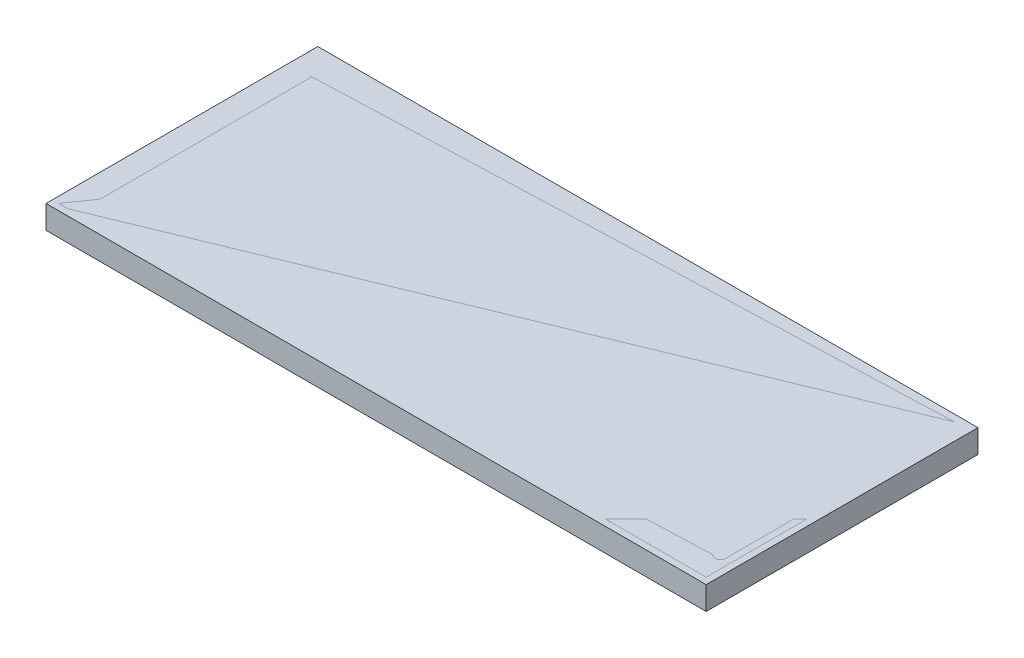
ISO-10303-21;
HEADER;
FILE_DESCRIPTION(('STEP AP214'),'2;1');
FILE_NAME('part.step','',(''),(''),'','','');
FILE_SCHEMA(('AUTOMOTIVE_DESIGN { 1 0 10303 214 1 1 1 1 }'));
ENDSEC;
DATA;
#1=APPLICATION_CONTEXT('core data for automotive mechanical design processes');
#2=APPLICATION_PROTOCOL_DEFINITION('international standard','automotive_design',2000,#1);
#3=PRODUCT_CONTEXT('',#1,'mechanical');
#4=PRODUCT('Part','Part','',(#3));
#5=PRODUCT_RELATED_PRODUCT_CATEGORY('part','',(#4));
#6=PRODUCT_DEFINITION_FORMATION('','',#4);
#7=PRODUCT_DEFINITION_CONTEXT('part definition',#1,'design');
#8=PRODUCT_DEFINITION('design','',#6,#7);
#9=PRODUCT_DEFINITION_SHAPE('','',#8);
#10=(LENGTH_UNIT() NAMED_UNIT(*) SI_UNIT(.MILLI.,.METRE.));
#11=(NAMED_UNIT(*) PLANE_ANGLE_UNIT() SI_UNIT($,.RADIAN.));
#12=(NAMED_UNIT(*) SI_UNIT($,.STERADIAN.) SOLID_ANGLE_UNIT());
#13=UNCERTAINTY_MEASURE_WITH_UNIT(LENGTH_MEASURE(1.E-05),#10,'distance_accuracy_value','');
#14=(GEOMETRIC_REPRESENTATION_CONTEXT(3) GLOBAL_UNCERTAINTY_ASSIGNED_CONTEXT((#13)) GLOBAL_UNIT_ASSIGNED_CONTEXT((#10,
#11,#12)) REPRESENTATION_CONTEXT('',''));
#15=CARTESIAN_POINT('',(0.,0.,0.));
#16=DIRECTION('',(0.,0.,1.));
#17=DIRECTION('',(1.,0.,0.));
#18=AXIS2_PLACEMENT_3D('',#15,#16,#17);
#19=CARTESIAN_POINT('',(-102.156267045852,299.622640817532,522.124764040882));
#20=DIRECTION('',(1.,0.,0.));
#21=DIRECTION('',(0.,0.,-1.));
#22=AXIS2_PLACEMENT_3D('',#19,#20,#21);
#23=PLANE('',#22);
#24=DIRECTION('',(0.,0.,1.));
#25=VECTOR('',#24,1.);
#26=CARTESIAN_POINT('',(-102.156267045852,281.622640817532,522.124764040882));
#27=LINE('',#26,#25);
#28=CARTESIAN_POINT('',(-102.156267045852,281.622640817532,322.124764040882));
#29=VERTEX_POINT('',#28);
#30=CARTESIAN_POINT('',(-102.156267045852,281.622640817532,522.124764040882));
#31=VERTEX_POINT('',#30);
#32=EDGE_CURVE('P0_E80',#29,#31,#27,.T.);
#33=ORIENTED_EDGE('',*,*,#32,.T.);
#34=DIRECTION('',(0.,-1.,0.));
#35=VECTOR('',#34,1.);
#36=CARTESIAN_POINT('',(-102.156267045852,299.622640817532,522.124764040882));
#37=LINE('',#36,#35);
#38=CARTESIAN_POINT('',(-102.156267045852,299.622640817532,522.124764040882));
#39=VERTEX_POINT('',#38);
#40=EDGE_CURVE('P0_E11',#39,#31,#37,.T.);
#41=ORIENTED_EDGE('',*,*,#40,.F.);
#42=DIRECTION('',(0.,0.,1.));
#43=VECTOR('',#42,1.);
#44=CARTESIAN_POINT('',(-102.156267045852,299.622640817532,522.124764040882));
#45=LINE('',#44,#43);
#46=CARTESIAN_POINT('',(-102.156267045852,299.622640817532,322.124764040882));
#47=VERTEX_POINT('',#46);
#48=EDGE_CURVE('P0_E68',#47,#39,#45,.T.);
#49=ORIENTED_EDGE('',*,*,#48,.F.);
#50=DIRECTION('',(0.,-1.,0.));
#51=VECTOR('',#50,1.);
#52=CARTESIAN_POINT('',(-102.156267045852,299.622640817532,322.124764040882));
#53=LINE('',#52,#51);
#54=EDGE_CURVE('P0_E76',#47,#29,#53,.T.);
#55=ORIENTED_EDGE('',*,*,#54,.T.);
#56=EDGE_LOOP('',(#33,#41,#49,#55));
#57=FACE_BOUND('',#56,.T.);
#58=ADVANCED_FACE('P0_F17',(#57),#23,.F.);
#59=CARTESIAN_POINT('',(-102.156267045852,299.622640817532,522.124764040882));
#60=DIRECTION('',(0.,0.,-1.));
#61=DIRECTION('',(-1.,0.,0.));
#62=AXIS2_PLACEMENT_3D('',#59,#60,#61);
#63=PLANE('',#62);
#64=DIRECTION('',(1.,0.,0.));
#65=VECTOR('',#64,1.);
#66=CARTESIAN_POINT('',(-102.156267045852,281.622640817532,522.124764040882));
#67=LINE('',#66,#65);
#68=CARTESIAN_POINT('',(397.843732954148,281.622640817532,522.124764040882));
#69=VERTEX_POINT('',#68);
#70=EDGE_CURVE('P0_E72',#31,#69,#67,.T.);
#71=ORIENTED_EDGE('',*,*,#70,.T.);
#72=DIRECTION('',(0.,-1.,0.));
#73=VECTOR('',#72,1.);
#74=CARTESIAN_POINT('',(397.843732954148,299.622640817532,522.124764040882));
#75=LINE('',#74,#73);
#76=CARTESIAN_POINT('',(397.843732954148,299.622640817532,522.124764040882));
#77=VERTEX_POINT('',#76);
#78=EDGE_CURVE('P0_E25',#77,#69,#75,.T.);
#79=ORIENTED_EDGE('',*,*,#78,.F.);
#80=DIRECTION('',(1.,0.,0.));
#81=VECTOR('',#80,1.);
#82=CARTESIAN_POINT('',(-102.156267045852,299.622640817532,522.124764040882));
#83=LINE('',#82,#81);
#84=EDGE_CURVE('P0_E63',#39,#77,#83,.T.);
#85=ORIENTED_EDGE('',*,*,#84,.F.);
#86=ORIENTED_EDGE('',*,*,#40,.T.);
#87=EDGE_LOOP('',(#71,#79,#85,#86));
#88=FACE_BOUND('',#87,.T.);
#89=ADVANCED_FACE('P0_F71',(#88),#63,.F.);
#90=CARTESIAN_POINT('',(397.843732954148,299.622640817532,522.124764040882));
#91=DIRECTION('',(-1.,0.,0.));
#92=DIRECTION('',(0.,0.,1.));
#93=AXIS2_PLACEMENT_3D('',#90,#91,#92);
#94=PLANE('',#93);
#95=DIRECTION('',(0.,0.,-1.));
#96=VECTOR('',#95,1.);
#97=CARTESIAN_POINT('',(397.843732954148,281.622640817532,522.124764040882));
#98=LINE('',#97,#96);
#99=CARTESIAN_POINT('',(397.843732954148,281.622640817532,322.124764040882));
#100=VERTEX_POINT('',#99);
#101=EDGE_CURVE('P0_E50',#69,#100,#98,.T.);
#102=ORIENTED_EDGE('',*,*,#101,.T.);
#103=DIRECTION('',(0.,-1.,0.));
#104=VECTOR('',#103,1.);
#105=CARTESIAN_POINT('',(397.843732954148,299.622640817532,322.124764040882));
#106=LINE('',#105,#104);
#107=CARTESIAN_POINT('',(397.843732954148,299.622640817532,322.124764040882));
#108=VERTEX_POINT('',#107);
#109=EDGE_CURVE('P0_E73',#108,#100,#106,.T.);
#110=ORIENTED_EDGE('',*,*,#109,.F.);
#111=DIRECTION('',(0.,0.,-1.));
#112=VECTOR('',#111,1.);
#113=CARTESIAN_POINT('',(397.843732954148,299.622640817532,522.124764040882));
#114=LINE('',#113,#112);
#115=EDGE_CURVE('P0_E66',#77,#108,#114,.T.);
#116=ORIENTED_EDGE('',*,*,#115,.F.);
#117=ORIENTED_EDGE('',*,*,#78,.T.);
#118=EDGE_LOOP('',(#102,#110,#116,#117));
#119=FACE_BOUND('',#118,.T.);
#120=ADVANCED_FACE('P0_F74',(#119),#94,.F.);
#121=CARTESIAN_POINT('',(-102.156267045852,299.622640817532,322.124764040882));
#122=DIRECTION('',(0.,0.,1.));
#123=DIRECTION('',(1.,0.,0.));
#124=AXIS2_PLACEMENT_3D('',#121,#122,#123);
#125=PLANE('',#124);
#126=DIRECTION('',(-1.,0.,0.));
#127=VECTOR('',#126,1.);
#128=CARTESIAN_POINT('',(-102.156267045852,281.622640817532,322.124764040882));
#129=LINE('',#128,#127);
#130=EDGE_CURVE('P0_E56',#100,#29,#129,.T.);
#131=ORIENTED_EDGE('',*,*,#130,.T.);
#132=ORIENTED_EDGE('',*,*,#54,.F.);
#133=DIRECTION('',(-1.,0.,0.));
#134=VECTOR('',#133,1.);
#135=CARTESIAN_POINT('',(-102.156267045852,299.622640817532,322.124764040882));
#136=LINE('',#135,#134);
#137=EDGE_CURVE('P0_E33',#108,#47,#136,.T.);
#138=ORIENTED_EDGE('',*,*,#137,.F.);
#139=ORIENTED_EDGE('',*,*,#109,.T.);
#140=EDGE_LOOP('',(#131,#132,#138,#139));
#141=FACE_BOUND('',#140,.T.);
#142=ADVANCED_FACE('P0_F88',(#141),#125,.F.);
#143=CARTESIAN_POINT('',(-102.156267045852,299.622640817532,522.124764040882));
#144=DIRECTION('',(0.,-1.,0.));
#145=DIRECTION('',(0.,0.,-1.));
#146=AXIS2_PLACEMENT_3D('',#143,#144,#145);
#147=PLANE('',#146);
#148=CARTESIAN_POINT('',(388.843732954146,299.622640817532,438.124764040882));
#149=DIRECTION('',(0.,1.,0.));
#150=DIRECTION('',(0.,0.,-1.));
#151=AXIS2_PLACEMENT_3D('',#148,#149,#150);
#152=CIRCLE('',#151,3.99999999999999);
#153=CARTESIAN_POINT('',(388.843732954146,299.622640817532,434.124764040882));
#154=VERTEX_POINT('',#153);
#155=EDGE_CURVE('P0_E124',#154,#154,#152,.T.);
#156=ORIENTED_EDGE('',*,*,#155,.F.);
#157=EDGE_LOOP('',(#156));
#158=FACE_BOUND('',#157,.T.);
#159=CARTESIAN_POINT('',(388.843732954146,299.622640817532,470.124764040882));
#160=DIRECTION('',(0.,1.,0.));
#161=DIRECTION('',(0.,0.,-1.));
#162=AXIS2_PLACEMENT_3D('',#159,#160,#161);
#163=CIRCLE('',#162,3.99999999999999);
#164=CARTESIAN_POINT('',(388.843732954146,299.622640817532,466.124764040882));
#165=VERTEX_POINT('',#164);
#166=EDGE_CURVE('P0_E131',#165,#165,#163,.T.);
#167=ORIENTED_EDGE('',*,*,#166,.F.);
#168=EDGE_LOOP('',(#167));
#169=FACE_BOUND('',#168,.T.);
#170=CARTESIAN_POINT('',(388.843732954145,299.622640817532,502.124764040882));
#171=DIRECTION('',(0.,1.,0.));
#172=DIRECTION('',(0.,0.,-1.));
#173=AXIS2_PLACEMENT_3D('',#170,#171,#172);
#174=CIRCLE('',#173,3.99999999999999);
#175=CARTESIAN_POINT('',(388.843732954145,299.622640817532,498.124764040882));
#176=VERTEX_POINT('',#175);
#177=EDGE_CURVE('P0_E137',#176,#176,#174,.T.);
#178=ORIENTED_EDGE('',*,*,#177,.F.);
#179=EDGE_LOOP('',(#178));
#180=FACE_BOUND('',#179,.T.);
#181=CARTESIAN_POINT('',(-93.1562670458501,299.622640817532,502.124764040882));
#182=DIRECTION('',(0.,1.,0.));
#183=DIRECTION('',(0.,0.,1.));
#184=AXIS2_PLACEMENT_3D('',#181,#182,#183);
#185=CIRCLE('',#184,4.);
#186=CARTESIAN_POINT('',(-93.1562670458501,299.622640817532,506.124764040882));
#187=VERTEX_POINT('',#186);
#188=EDGE_CURVE('P0_E143',#187,#187,#185,.T.);
#189=ORIENTED_EDGE('',*,*,#188,.F.);
#190=EDGE_LOOP('',(#189));
#191=FACE_BOUND('',#190,.T.);
#192=CARTESIAN_POINT('',(-93.1562670458506,299.622640817532,470.124764040882));
#193=DIRECTION('',(0.,1.,0.));
#194=DIRECTION('',(0.,0.,1.));
#195=AXIS2_PLACEMENT_3D('',#192,#193,#194);
#196=CIRCLE('',#195,4.);
#197=CARTESIAN_POINT('',(-93.1562670458506,299.622640817532,474.124764040882));
#198=VERTEX_POINT('',#197);
#199=EDGE_CURVE('P0_E100',#198,#198,#196,.T.);
#200=ORIENTED_EDGE('',*,*,#199,.F.);
#201=EDGE_LOOP('',(#200));
#202=FACE_BOUND('',#201,.T.);
#203=CARTESIAN_POINT('',(-93.156267045851,299.622640817532,438.124764040882));
#204=DIRECTION('',(0.,1.,0.));
#205=DIRECTION('',(0.,0.,1.));
#206=AXIS2_PLACEMENT_3D('',#203,#204,#205);
#207=CIRCLE('',#206,4.);
#208=CARTESIAN_POINT('',(-93.156267045851,299.622640817532,442.124764040882));
#209=VERTEX_POINT('',#208);
#210=EDGE_CURVE('P0_E107',#209,#209,#207,.T.);
#211=ORIENTED_EDGE('',*,*,#210,.F.);
#212=EDGE_LOOP('',(#211));
#213=FACE_BOUND('',#212,.T.);
#214=CARTESIAN_POINT('',(-93.1562670458515,299.622640817532,406.124764040882));
#215=DIRECTION('',(0.,1.,0.));
#216=DIRECTION('',(0.,0.,1.));
#217=AXIS2_PLACEMENT_3D('',#214,#215,#216);
#218=CIRCLE('',#217,4.);
#219=CARTESIAN_POINT('',(-93.1562670458515,299.622640817532,410.124764040882));
#220=VERTEX_POINT('',#219);
#221=EDGE_CURVE('P0_E113',#220,#220,#218,.T.);
#222=ORIENTED_EDGE('',*,*,#221,.F.);
#223=EDGE_LOOP('',(#222));
#224=FACE_BOUND('',#223,.T.);
#225=CARTESIAN_POINT('',(-93.1562670458519,299.622640817532,374.124764040882));
#226=DIRECTION('',(0.,1.,0.));
#227=DIRECTION('',(0.,0.,1.));
#228=AXIS2_PLACEMENT_3D('',#225,#226,#227);
#229=CIRCLE('',#228,4.);
#230=CARTESIAN_POINT('',(-93.1562670458519,299.622640817532,378.124764040882));
#231=VERTEX_POINT('',#230);
#232=EDGE_CURVE('P0_E119',#231,#231,#229,.T.);
#233=ORIENTED_EDGE('',*,*,#232,.F.);
#234=EDGE_LOOP('',(#233));
#235=FACE_BOUND('',#234,.T.);
#236=CARTESIAN_POINT('',(388.843732954147,299.622640817532,406.124764040882));
#237=DIRECTION('',(0.,1.,0.));
#238=DIRECTION('',(0.,0.,-1.));
#239=AXIS2_PLACEMENT_3D('',#236,#237,#238);
#240=CIRCLE('',#239,3.99999999999999);
#241=CARTESIAN_POINT('',(388.843732954147,299.622640817532,402.124764040882));
#242=VERTEX_POINT('',#241);
#243=EDGE_CURVE('P0_E160',#242,#242,#240,.T.);
#244=ORIENTED_EDGE('',*,*,#243,.F.);
#245=EDGE_LOOP('',(#244));
#246=FACE_BOUND('',#245,.T.);
#247=CARTESIAN_POINT('',(388.843732954147,299.622640817532,374.124764040882));
#248=DIRECTION('',(0.,1.,0.));
#249=DIRECTION('',(0.,0.,-1.));
#250=AXIS2_PLACEMENT_3D('',#247,#248,#249);
#251=CIRCLE('',#250,3.99999999999999);
#252=CARTESIAN_POINT('',(388.843732954147,299.622640817532,370.124764040882));
#253=VERTEX_POINT('',#252);
#254=EDGE_CURVE('P0_E154',#253,#253,#251,.T.);
#255=ORIENTED_EDGE('',*,*,#254,.F.);
#256=EDGE_LOOP('',(#255));
#257=FACE_BOUND('',#256,.T.);
#258=CARTESIAN_POINT('',(388.843732954148,299.622640817532,342.124764040882));
#259=DIRECTION('',(0.,1.,0.));
#260=DIRECTION('',(0.,0.,-1.));
#261=AXIS2_PLACEMENT_3D('',#258,#259,#260);
#262=CIRCLE('',#261,3.99999999999999);
#263=CARTESIAN_POINT('',(388.843732954148,299.622640817532,338.124764040882));
#264=VERTEX_POINT('',#263);
#265=EDGE_CURVE('P0_E148',#264,#264,#262,.T.);
#266=ORIENTED_EDGE('',*,*,#265,.F.);
#267=EDGE_LOOP('',(#266));
#268=FACE_BOUND('',#267,.T.);
#269=CARTESIAN_POINT('',(-93.1562670458524,299.622640817532,342.124764040882));
#270=DIRECTION('',(0.,1.,0.));
#271=DIRECTION('',(0.,0.,1.));
#272=AXIS2_PLACEMENT_3D('',#269,#270,#271);
#273=CIRCLE('',#272,4.);
#274=CARTESIAN_POINT('',(-93.1562670458524,299.622640817532,346.124764040882));
#275=VERTEX_POINT('',#274);
#276=EDGE_CURVE('P0_E94',#275,#275,#273,.T.);
#277=ORIENTED_EDGE('',*,*,#276,.F.);
#278=EDGE_LOOP('',(#277));
#279=FACE_BOUND('',#278,.T.);
#280=ORIENTED_EDGE('',*,*,#48,.T.);
#281=ORIENTED_EDGE('',*,*,#84,.T.);
#282=ORIENTED_EDGE('',*,*,#115,.T.);
#283=ORIENTED_EDGE('',*,*,#137,.T.);
#284=EDGE_LOOP('',(#280,#281,#282,#283));
#285=FACE_BOUND('',#284,.T.);
#286=ADVANCED_FACE('P0_F64',(#158,#169,#180,#191,#202,#213,#224,#235,#246,#257,#268,#279,#285),
#147,.F.);
#287=CARTESIAN_POINT('',(-102.156267045852,281.622640817532,522.124764040882));
#288=DIRECTION('',(0.,-1.,0.));
#289=DIRECTION('',(0.,0.,-1.));
#290=AXIS2_PLACEMENT_3D('',#287,#288,#289);
#291=PLANE('',#290);
#292=ORIENTED_EDGE('',*,*,#32,.F.);
#293=ORIENTED_EDGE('',*,*,#130,.F.);
#294=ORIENTED_EDGE('',*,*,#101,.F.);
#295=ORIENTED_EDGE('',*,*,#70,.F.);
#296=EDGE_LOOP('',(#292,#293,#294,#295));
#297=FACE_BOUND('',#296,.T.);
#298=ADVANCED_FACE('P0_F91',(#297),#291,.T.);
#299=CARTESIAN_POINT('',(-93.1562670458524,289.622640817532,342.124764040882));
#300=DIRECTION('',(0.,1.,0.));
#301=DIRECTION('',(0.,0.,1.));
#302=AXIS2_PLACEMENT_3D('',#299,#300,#301);
#303=CYLINDRICAL_SURFACE('',#302,4.);
#304=CARTESIAN_POINT('',(-93.1562670458524,289.622640817532,342.124764040882));
#305=DIRECTION('',(0.,1.,0.));
#306=DIRECTION('',(0.,0.,1.));
#307=AXIS2_PLACEMENT_3D('',#304,#305,#306);
#308=CIRCLE('',#307,4.);
#309=CARTESIAN_POINT('',(-93.1562670458524,289.622640817532,346.124764040882));
#310=VERTEX_POINT('',#309);
#311=EDGE_CURVE('P0_E83',#310,#310,#308,.T.);
#312=ORIENTED_EDGE('',*,*,#311,.F.);
#313=EDGE_LOOP('',(#312));
#314=FACE_BOUND('',#313,.T.);
#315=ORIENTED_EDGE('',*,*,#276,.T.);
#316=EDGE_LOOP('',(#315));
#317=FACE_BOUND('',#316,.T.);
#318=ADVANCED_FACE('P0_F185',(#314,#317),#303,.F.);
#319=CARTESIAN_POINT('',(-93.1562670458524,289.622640817532,342.124764040882));
#320=DIRECTION('',(0.,1.,0.));
#321=DIRECTION('',(0.,0.,1.));
#322=AXIS2_PLACEMENT_3D('',#319,#320,#321);
#323=PLANE('',#322);
#324=ORIENTED_EDGE('',*,*,#311,.T.);
#325=EDGE_LOOP('',(#324));
#326=FACE_BOUND('',#325,.T.);
#327=ADVANCED_FACE('P0_F187',(#326),#323,.T.);
#328=CARTESIAN_POINT('',(388.843732954148,289.622640817532,342.124764040882));
#329=DIRECTION('',(0.,1.,0.));
#330=DIRECTION('',(0.,0.,1.));
#331=AXIS2_PLACEMENT_3D('',#328,#329,#330);
#332=CYLINDRICAL_SURFACE('',#331,3.99999999999999);
#333=CARTESIAN_POINT('',(388.843732954148,289.622640817532,342.124764040882));
#334=DIRECTION('',(0.,1.,0.));
#335=DIRECTION('',(0.,0.,-1.));
#336=AXIS2_PLACEMENT_3D('',#333,#334,#335);
#337=CIRCLE('',#336,3.99999999999999);
#338=CARTESIAN_POINT('',(388.843732954148,289.622640817532,338.124764040882));
#339=VERTEX_POINT('',#338);
#340=EDGE_CURVE('P0_E151',#339,#339,#337,.T.);
#341=ORIENTED_EDGE('',*,*,#340,.F.);
#342=EDGE_LOOP('',(#341));
#343=FACE_BOUND('',#342,.T.);
#344=ORIENTED_EDGE('',*,*,#265,.T.);
#345=EDGE_LOOP('',(#344));
#346=FACE_BOUND('',#345,.T.);
#347=ADVANCED_FACE('P0_F195',(#343,#346),#332,.F.);
#348=CARTESIAN_POINT('',(388.843732954148,289.622640817532,342.124764040882));
#349=DIRECTION('',(0.,-1.,0.));
#350=DIRECTION('',(0.,0.,-1.));
#351=AXIS2_PLACEMENT_3D('',#348,#349,#350);
#352=PLANE('',#351);
#353=ORIENTED_EDGE('',*,*,#340,.T.);
#354=EDGE_LOOP('',(#353));
#355=FACE_BOUND('',#354,.T.);
#356=ADVANCED_FACE('P0_F246',(#355),#352,.F.);
#357=CARTESIAN_POINT('',(388.843732954147,289.622640817532,374.124764040882));
#358=DIRECTION('',(0.,1.,0.));
#359=DIRECTION('',(0.,0.,1.));
#360=AXIS2_PLACEMENT_3D('',#357,#358,#359);
#361=CYLINDRICAL_SURFACE('',#360,3.99999999999999);
#362=CARTESIAN_POINT('',(388.843732954147,289.622640817532,374.124764040882));
#363=DIRECTION('',(0.,1.,0.));
#364=DIRECTION('',(0.,0.,-1.));
#365=AXIS2_PLACEMENT_3D('',#362,#363,#364);
#366=CIRCLE('',#365,3.99999999999999);
#367=CARTESIAN_POINT('',(388.843732954147,289.622640817532,370.124764040882));
#368=VERTEX_POINT('',#367);
#369=EDGE_CURVE('P0_E157',#368,#368,#366,.T.);
#370=ORIENTED_EDGE('',*,*,#369,.F.);
#371=EDGE_LOOP('',(#370));
#372=FACE_BOUND('',#371,.T.);
#373=ORIENTED_EDGE('',*,*,#254,.T.);
#374=EDGE_LOOP('',(#373));
#375=FACE_BOUND('',#374,.T.);
#376=ADVANCED_FACE('P0_F256',(#372,#375),#361,.F.);
#377=CARTESIAN_POINT('',(388.843732954147,289.622640817532,374.124764040882));
#378=DIRECTION('',(0.,-1.,0.));
#379=DIRECTION('',(0.,0.,-1.));
#380=AXIS2_PLACEMENT_3D('',#377,#378,#379);
#381=PLANE('',#380);
#382=ORIENTED_EDGE('',*,*,#369,.T.);
#383=EDGE_LOOP('',(#382));
#384=FACE_BOUND('',#383,.T.);
#385=ADVANCED_FACE('P0_F171',(#384),#381,.F.);
#386=CARTESIAN_POINT('',(388.843732954147,289.622640817532,406.124764040882));
#387=DIRECTION('',(0.,1.,0.));
#388=DIRECTION('',(0.,0.,1.));
#389=AXIS2_PLACEMENT_3D('',#386,#387,#388);
#390=CYLINDRICAL_SURFACE('',#389,3.99999999999999);
#391=CARTESIAN_POINT('',(388.843732954147,289.622640817532,406.124764040882));
#392=DIRECTION('',(0.,1.,0.));
#393=DIRECTION('',(0.,0.,-1.));
#394=AXIS2_PLACEMENT_3D('',#391,#392,#393);
#395=CIRCLE('',#394,3.99999999999999);
#396=CARTESIAN_POINT('',(388.843732954147,289.622640817532,402.124764040882));
#397=VERTEX_POINT('',#396);
#398=EDGE_CURVE('P0_E128',#397,#397,#395,.T.);
#399=ORIENTED_EDGE('',*,*,#398,.F.);
#400=EDGE_LOOP('',(#399));
#401=FACE_BOUND('',#400,.T.);
#402=ORIENTED_EDGE('',*,*,#243,.T.);
#403=EDGE_LOOP('',(#402));
#404=FACE_BOUND('',#403,.T.);
#405=ADVANCED_FACE('P0_F168',(#401,#404),#390,.F.);
#406=CARTESIAN_POINT('',(388.843732954147,289.622640817532,406.124764040882));
#407=DIRECTION('',(0.,-1.,0.));
#408=DIRECTION('',(0.,0.,-1.));
#409=AXIS2_PLACEMENT_3D('',#406,#407,#408);
#410=PLANE('',#409);
#411=ORIENTED_EDGE('',*,*,#398,.T.);
#412=EDGE_LOOP('',(#411));
#413=FACE_BOUND('',#412,.T.);
#414=ADVANCED_FACE('P0_F166',(#413),#410,.F.);
#415=CARTESIAN_POINT('',(-93.1562670458519,289.622640817532,374.124764040882));
#416=DIRECTION('',(0.,1.,0.));
#417=DIRECTION('',(0.,0.,1.));
#418=AXIS2_PLACEMENT_3D('',#415,#416,#417);
#419=CYLINDRICAL_SURFACE('',#418,4.);
#420=CARTESIAN_POINT('',(-93.1562670458519,289.622640817532,374.124764040882));
#421=DIRECTION('',(0.,1.,0.));
#422=DIRECTION('',(0.,0.,1.));
#423=AXIS2_PLACEMENT_3D('',#420,#421,#422);
#424=CIRCLE('',#423,4.);
#425=CARTESIAN_POINT('',(-93.1562670458519,289.622640817532,378.124764040882));
#426=VERTEX_POINT('',#425);
#427=EDGE_CURVE('P0_E97',#426,#426,#424,.T.);
#428=ORIENTED_EDGE('',*,*,#427,.F.);
#429=EDGE_LOOP('',(#428));
#430=FACE_BOUND('',#429,.T.);
#431=ORIENTED_EDGE('',*,*,#232,.T.);
#432=EDGE_LOOP('',(#431));
#433=FACE_BOUND('',#432,.T.);
#434=ADVANCED_FACE('P0_F290',(#430,#433),#419,.F.);
#435=CARTESIAN_POINT('',(-93.1562670458519,289.622640817532,374.124764040882));
#436=DIRECTION('',(0.,1.,0.));
#437=DIRECTION('',(0.,0.,1.));
#438=AXIS2_PLACEMENT_3D('',#435,#436,#437);
#439=PLANE('',#438);
#440=ORIENTED_EDGE('',*,*,#427,.T.);
#441=EDGE_LOOP('',(#440));
#442=FACE_BOUND('',#441,.T.);
#443=ADVANCED_FACE('P0_F299',(#442),#439,.T.);
#444=CARTESIAN_POINT('',(-93.1562670458515,289.622640817532,406.124764040882));
#445=DIRECTION('',(0.,1.,0.));
#446=DIRECTION('',(0.,0.,1.));
#447=AXIS2_PLACEMENT_3D('',#444,#445,#446);
#448=CYLINDRICAL_SURFACE('',#447,4.);
#449=CARTESIAN_POINT('',(-93.1562670458515,289.622640817532,406.124764040882));
#450=DIRECTION('',(0.,1.,0.));
#451=DIRECTION('',(0.,0.,1.));
#452=AXIS2_PLACEMENT_3D('',#449,#450,#451);
#453=CIRCLE('',#452,4.);
#454=CARTESIAN_POINT('',(-93.1562670458515,289.622640817532,410.124764040882));
#455=VERTEX_POINT('',#454);
#456=EDGE_CURVE('P0_E116',#455,#455,#453,.T.);
#457=ORIENTED_EDGE('',*,*,#456,.F.);
#458=EDGE_LOOP('',(#457));
#459=FACE_BOUND('',#458,.T.);
#460=ORIENTED_EDGE('',*,*,#221,.T.);
#461=EDGE_LOOP('',(#460));
#462=FACE_BOUND('',#461,.T.);
#463=ADVANCED_FACE('P0_F309',(#459,#462),#448,.F.);
#464=CARTESIAN_POINT('',(-93.1562670458515,289.622640817532,406.124764040882));
#465=DIRECTION('',(0.,1.,0.));
#466=DIRECTION('',(0.,0.,1.));
#467=AXIS2_PLACEMENT_3D('',#464,#465,#466);
#468=PLANE('',#467);
#469=ORIENTED_EDGE('',*,*,#456,.T.);
#470=EDGE_LOOP('',(#469));
#471=FACE_BOUND('',#470,.T.);
#472=ADVANCED_FACE('P0_F319',(#471),#468,.T.);
#473=CARTESIAN_POINT('',(-93.156267045851,289.622640817532,438.124764040882));
#474=DIRECTION('',(0.,1.,0.));
#475=DIRECTION('',(0.,0.,1.));
#476=AXIS2_PLACEMENT_3D('',#473,#474,#475);
#477=CYLINDRICAL_SURFACE('',#476,4.);
#478=CARTESIAN_POINT('',(-93.156267045851,289.622640817532,438.124764040882));
#479=DIRECTION('',(0.,1.,0.));
#480=DIRECTION('',(0.,0.,1.));
#481=AXIS2_PLACEMENT_3D('',#478,#479,#480);
#482=CIRCLE('',#481,4.);
#483=CARTESIAN_POINT('',(-93.156267045851,289.622640817532,442.124764040882));
#484=VERTEX_POINT('',#483);
#485=EDGE_CURVE('P0_E110',#484,#484,#482,.T.);
#486=ORIENTED_EDGE('',*,*,#485,.F.);
#487=EDGE_LOOP('',(#486));
#488=FACE_BOUND('',#487,.T.);
#489=ORIENTED_EDGE('',*,*,#210,.T.);
#490=EDGE_LOOP('',(#489));
#491=FACE_BOUND('',#490,.T.);
#492=ADVANCED_FACE('P0_F329',(#488,#491),#477,.F.);
#493=CARTESIAN_POINT('',(-93.156267045851,289.622640817532,438.124764040882));
#494=DIRECTION('',(0.,1.,0.));
#495=DIRECTION('',(0.,0.,1.));
#496=AXIS2_PLACEMENT_3D('',#493,#494,#495);
#497=PLANE('',#496);
#498=ORIENTED_EDGE('',*,*,#485,.T.);
#499=EDGE_LOOP('',(#498));
#500=FACE_BOUND('',#499,.T.);
#501=ADVANCED_FACE('P0_F339',(#500),#497,.T.);
#502=CARTESIAN_POINT('',(-93.1562670458506,289.622640817532,470.124764040882));
#503=DIRECTION('',(0.,1.,0.));
#504=DIRECTION('',(0.,0.,1.));
#505=AXIS2_PLACEMENT_3D('',#502,#503,#504);
#506=CYLINDRICAL_SURFACE('',#505,4.);
#507=CARTESIAN_POINT('',(-93.1562670458506,289.622640817532,470.124764040882));
#508=DIRECTION('',(0.,1.,0.));
#509=DIRECTION('',(0.,0.,1.));
#510=AXIS2_PLACEMENT_3D('',#507,#508,#509);
#511=CIRCLE('',#510,4.);
#512=CARTESIAN_POINT('',(-93.1562670458506,289.622640817532,474.124764040882));
#513=VERTEX_POINT('',#512);
#514=EDGE_CURVE('P0_E103',#513,#513,#511,.T.);
#515=ORIENTED_EDGE('',*,*,#514,.F.);
#516=EDGE_LOOP('',(#515));
#517=FACE_BOUND('',#516,.T.);
#518=ORIENTED_EDGE('',*,*,#199,.T.);
#519=EDGE_LOOP('',(#518));
#520=FACE_BOUND('',#519,.T.);
#521=ADVANCED_FACE('P0_F349',(#517,#520),#506,.F.);
#522=CARTESIAN_POINT('',(-93.1562670458506,289.622640817532,470.124764040882));
#523=DIRECTION('',(0.,1.,0.));
#524=DIRECTION('',(0.,0.,1.));
#525=AXIS2_PLACEMENT_3D('',#522,#523,#524);
#526=PLANE('',#525);
#527=ORIENTED_EDGE('',*,*,#514,.T.);
#528=EDGE_LOOP('',(#527));
#529=FACE_BOUND('',#528,.T.);
#530=ADVANCED_FACE('P0_F359',(#529),#526,.T.);
#531=CARTESIAN_POINT('',(-93.1562670458501,289.622640817532,502.124764040882));
#532=DIRECTION('',(0.,1.,0.));
#533=DIRECTION('',(0.,0.,1.));
#534=AXIS2_PLACEMENT_3D('',#531,#532,#533);
#535=CYLINDRICAL_SURFACE('',#534,4.);
#536=CARTESIAN_POINT('',(-93.1562670458501,289.622640817532,502.124764040882));
#537=DIRECTION('',(0.,1.,0.));
#538=DIRECTION('',(0.,0.,1.));
#539=AXIS2_PLACEMENT_3D('',#536,#537,#538);
#540=CIRCLE('',#539,4.);
#541=CARTESIAN_POINT('',(-93.1562670458501,289.622640817532,506.124764040882));
#542=VERTEX_POINT('',#541);
#543=EDGE_CURVE('P0_E104',#542,#542,#540,.T.);
#544=ORIENTED_EDGE('',*,*,#543,.F.);
#545=EDGE_LOOP('',(#544));
#546=FACE_BOUND('',#545,.T.);
#547=ORIENTED_EDGE('',*,*,#188,.T.);
#548=EDGE_LOOP('',(#547));
#549=FACE_BOUND('',#548,.T.);
#550=ADVANCED_FACE('P0_F369',(#546,#549),#535,.F.);
#551=CARTESIAN_POINT('',(-93.1562670458501,289.622640817532,502.124764040882));
#552=DIRECTION('',(0.,1.,0.));
#553=DIRECTION('',(0.,0.,1.));
#554=AXIS2_PLACEMENT_3D('',#551,#552,#553);
#555=PLANE('',#554);
#556=ORIENTED_EDGE('',*,*,#543,.T.);
#557=EDGE_LOOP('',(#556));
#558=FACE_BOUND('',#557,.T.);
#559=ADVANCED_FACE('P0_F379',(#558),#555,.T.);
#560=CARTESIAN_POINT('',(388.843732954145,289.622640817532,502.124764040882));
#561=DIRECTION('',(0.,1.,0.));
#562=DIRECTION('',(0.,0.,1.));
#563=AXIS2_PLACEMENT_3D('',#560,#561,#562);
#564=CYLINDRICAL_SURFACE('',#563,3.99999999999999);
#565=CARTESIAN_POINT('',(388.843732954145,289.622640817532,502.124764040882));
#566=DIRECTION('',(0.,1.,0.));
#567=DIRECTION('',(0.,0.,-1.));
#568=AXIS2_PLACEMENT_3D('',#565,#566,#567);
#569=CIRCLE('',#568,3.99999999999999);
#570=CARTESIAN_POINT('',(388.843732954145,289.622640817532,498.124764040882));
#571=VERTEX_POINT('',#570);
#572=EDGE_CURVE('P0_E140',#571,#571,#569,.T.);
#573=ORIENTED_EDGE('',*,*,#572,.F.);
#574=EDGE_LOOP('',(#573));
#575=FACE_BOUND('',#574,.T.);
#576=ORIENTED_EDGE('',*,*,#177,.T.);
#577=EDGE_LOOP('',(#576));
#578=FACE_BOUND('',#577,.T.);
#579=ADVANCED_FACE('P0_F389',(#575,#578),#564,.F.);
#580=CARTESIAN_POINT('',(388.843732954145,289.622640817532,502.124764040882));
#581=DIRECTION('',(0.,-1.,0.));
#582=DIRECTION('',(0.,0.,-1.));
#583=AXIS2_PLACEMENT_3D('',#580,#581,#582);
#584=PLANE('',#583);
#585=ORIENTED_EDGE('',*,*,#572,.T.);
#586=EDGE_LOOP('',(#585));
#587=FACE_BOUND('',#586,.T.);
#588=ADVANCED_FACE('P0_F399',(#587),#584,.F.);
#589=CARTESIAN_POINT('',(388.843732954146,289.622640817532,470.124764040882));
#590=DIRECTION('',(0.,1.,0.));
#591=DIRECTION('',(0.,0.,1.));
#592=AXIS2_PLACEMENT_3D('',#589,#590,#591);
#593=CYLINDRICAL_SURFACE('',#592,3.99999999999999);
#594=CARTESIAN_POINT('',(388.843732954146,289.622640817532,470.124764040882));
#595=DIRECTION('',(0.,1.,0.));
#596=DIRECTION('',(0.,0.,-1.));
#597=AXIS2_PLACEMENT_3D('',#594,#595,#596);
#598=CIRCLE('',#597,3.99999999999999);
#599=CARTESIAN_POINT('',(388.843732954146,289.622640817532,466.124764040882));
#600=VERTEX_POINT('',#599);
#601=EDGE_CURVE('P0_E134',#600,#600,#598,.T.);
#602=ORIENTED_EDGE('',*,*,#601,.F.);
#603=EDGE_LOOP('',(#602));
#604=FACE_BOUND('',#603,.T.);
#605=ORIENTED_EDGE('',*,*,#166,.T.);
#606=EDGE_LOOP('',(#605));
#607=FACE_BOUND('',#606,.T.);
#608=ADVANCED_FACE('P0_F409',(#604,#607),#593,.F.);
#609=CARTESIAN_POINT('',(388.843732954146,289.622640817532,470.124764040882));
#610=DIRECTION('',(0.,-1.,0.));
#611=DIRECTION('',(0.,0.,-1.));
#612=AXIS2_PLACEMENT_3D('',#609,#610,#611);
#613=PLANE('',#612);
#614=ORIENTED_EDGE('',*,*,#601,.T.);
#615=EDGE_LOOP('',(#614));
#616=FACE_BOUND('',#615,.T.);
#617=ADVANCED_FACE('P0_F419',(#616),#613,.F.);
#618=CARTESIAN_POINT('',(388.843732954146,289.622640817532,438.124764040882));
#619=DIRECTION('',(0.,1.,0.));
#620=DIRECTION('',(0.,0.,1.));
#621=AXIS2_PLACEMENT_3D('',#618,#619,#620);
#622=CYLINDRICAL_SURFACE('',#621,3.99999999999999);
#623=CARTESIAN_POINT('',(388.843732954146,289.622640817532,438.124764040882));
#624=DIRECTION('',(0.,1.,0.));
#625=DIRECTION('',(0.,0.,-1.));
#626=AXIS2_PLACEMENT_3D('',#623,#624,#625);
#627=CIRCLE('',#626,3.99999999999999);
#628=CARTESIAN_POINT('',(388.843732954146,289.622640817532,434.124764040882));
#629=VERTEX_POINT('',#628);
#630=EDGE_CURVE('P0_E127',#629,#629,#627,.T.);
#631=ORIENTED_EDGE('',*,*,#630,.F.);
#632=EDGE_LOOP('',(#631));
#633=FACE_BOUND('',#632,.T.);
#634=ORIENTED_EDGE('',*,*,#155,.T.);
#635=EDGE_LOOP('',(#634));
#636=FACE_BOUND('',#635,.T.);
#637=ADVANCED_FACE('P0_F429',(#633,#636),#622,.F.);
#638=CARTESIAN_POINT('',(388.843732954146,289.622640817532,438.124764040882));
#639=DIRECTION('',(0.,-1.,0.));
#640=DIRECTION('',(0.,0.,-1.));
#641=AXIS2_PLACEMENT_3D('',#638,#639,#640);
#642=PLANE('',#641);
#643=ORIENTED_EDGE('',*,*,#630,.T.);
#644=EDGE_LOOP('',(#643));
#645=FACE_BOUND('',#644,.T.);
#646=ADVANCED_FACE('P0_F439',(#645),#642,.F.);
#647=CLOSED_SHELL('',(#58,#89,#120,#142,#286,#298,#318,#327,#347,#356,#376,#385,#405,#414,#434,
#443,#463,#472,#492,#501,#521,#530,#550,#559,#579,#588,#608,#617,#637,#646));
#648=MANIFOLD_SOLID_BREP('P0_B1',#647);
#649=CARTESIAN_POINT('',(-107.156267045852,281.622640817532,317.124764040882));
#650=DIRECTION('',(-1.,0.,0.));
#651=DIRECTION('',(0.,0.,1.));
#652=AXIS2_PLACEMENT_3D('',#649,#650,#651);
#653=PLANE('',#652);
#654=DIRECTION('',(0.,0.,1.));
#655=VECTOR('',#654,1.);
#656=CARTESIAN_POINT('',(-107.156267045852,299.622640817532,317.124764040882));
#657=LINE('',#656,#655);
#658=CARTESIAN_POINT('',(-107.156267045852,299.622640817532,317.124764040882));
#659=VERTEX_POINT('',#658);
#660=CARTESIAN_POINT('',(-107.156267045852,299.622640817532,527.124764040882));
#661=VERTEX_POINT('',#660);
#662=EDGE_CURVE('P1_E80',#659,#661,#657,.T.);
#663=ORIENTED_EDGE('',*,*,#662,.F.);
#664=DIRECTION('',(0.,1.,0.));
#665=VECTOR('',#664,1.);
#666=CARTESIAN_POINT('',(-107.156267045852,281.622640817532,317.124764040882));
#667=LINE('',#666,#665);
#668=CARTESIAN_POINT('',(-107.156267045852,281.622640817532,317.124764040882));
#669=VERTEX_POINT('',#668);
#670=EDGE_CURVE('P1_E10',#669,#659,#667,.T.);
#671=ORIENTED_EDGE('',*,*,#670,.F.);
#672=DIRECTION('',(0.,0.,1.));
#673=VECTOR('',#672,1.);
#674=CARTESIAN_POINT('',(-107.156267045852,281.622640817532,317.124764040882));
#675=LINE('',#674,#673);
#676=CARTESIAN_POINT('',(-107.156267045852,281.622640817532,527.124764040882));
#677=VERTEX_POINT('',#676);
#678=EDGE_CURVE('P1_E74',#669,#677,#675,.T.);
#679=ORIENTED_EDGE('',*,*,#678,.T.);
#680=DIRECTION('',(0.,1.,0.));
#681=VECTOR('',#680,1.);
#682=CARTESIAN_POINT('',(-107.156267045852,281.622640817532,527.124764040882));
#683=LINE('',#682,#681);
#684=EDGE_CURVE('P1_E19',#677,#661,#683,.T.);
#685=ORIENTED_EDGE('',*,*,#684,.T.);
#686=EDGE_LOOP('',(#663,#671,#679,#685));
#687=FACE_BOUND('',#686,.T.);
#688=ADVANCED_FACE('P1_F16',(#687),#653,.T.);
#689=CARTESIAN_POINT('',(-107.156267045852,281.622640817532,317.124764040882));
#690=DIRECTION('',(0.,0.,-1.));
#691=DIRECTION('',(0.,1.,0.));
#692=AXIS2_PLACEMENT_3D('',#689,#690,#691);
#693=PLANE('',#692);
#694=DIRECTION('',(-1.,0.,0.));
#695=VECTOR('',#694,1.);
#696=CARTESIAN_POINT('',(-107.156267045852,299.622640817532,317.124764040882));
#697=LINE('',#696,#695);
#698=CARTESIAN_POINT('',(402.843732954148,299.622640817532,317.124764040882));
#699=VERTEX_POINT('',#698);
#700=EDGE_CURVE('P1_E76',#699,#659,#697,.T.);
#701=ORIENTED_EDGE('',*,*,#700,.F.);
#702=DIRECTION('',(0.,1.,0.));
#703=VECTOR('',#702,1.);
#704=CARTESIAN_POINT('',(402.843732954148,281.622640817532,317.124764040882));
#705=LINE('',#704,#703);
#706=CARTESIAN_POINT('',(402.843732954148,281.622640817532,317.124764040882));
#707=VERTEX_POINT('',#706);
#708=EDGE_CURVE('P1_E25',#707,#699,#705,.T.);
#709=ORIENTED_EDGE('',*,*,#708,.F.);
#710=DIRECTION('',(-1.,0.,0.));
#711=VECTOR('',#710,1.);
#712=CARTESIAN_POINT('',(-107.156267045852,281.622640817532,317.124764040882));
#713=LINE('',#712,#711);
#714=EDGE_CURVE('P1_E71',#707,#669,#713,.T.);
#715=ORIENTED_EDGE('',*,*,#714,.T.);
#716=ORIENTED_EDGE('',*,*,#670,.T.);
#717=EDGE_LOOP('',(#701,#709,#715,#716));
#718=FACE_BOUND('',#717,.T.);
#719=ADVANCED_FACE('P1_F90',(#718),#693,.T.);
#720=CARTESIAN_POINT('',(402.843732954148,281.622640817532,317.124764040882));
#721=DIRECTION('',(1.,0.,0.));
#722=DIRECTION('',(0.,-1.,0.));
#723=AXIS2_PLACEMENT_3D('',#720,#721,#722);
#724=PLANE('',#723);
#725=DIRECTION('',(0.,0.,-1.));
#726=VECTOR('',#725,1.);
#727=CARTESIAN_POINT('',(402.843732954148,299.622640817532,317.124764040882));
#728=LINE('',#727,#726);
#729=CARTESIAN_POINT('',(402.843732954148,299.622640817532,527.124764040882));
#730=VERTEX_POINT('',#729);
#731=EDGE_CURVE('P1_E66',#730,#699,#728,.T.);
#732=ORIENTED_EDGE('',*,*,#731,.F.);
#733=DIRECTION('',(0.,1.,0.));
#734=VECTOR('',#733,1.);
#735=CARTESIAN_POINT('',(402.843732954148,281.622640817532,527.124764040882));
#736=LINE('',#735,#734);
#737=CARTESIAN_POINT('',(402.843732954148,281.622640817532,527.124764040882));
#738=VERTEX_POINT('',#737);
#739=EDGE_CURVE('P1_E61',#738,#730,#736,.T.);
#740=ORIENTED_EDGE('',*,*,#739,.F.);
#741=DIRECTION('',(0.,0.,-1.));
#742=VECTOR('',#741,1.);
#743=CARTESIAN_POINT('',(402.843732954148,281.622640817532,317.124764040882));
#744=LINE('',#743,#742);
#745=EDGE_CURVE('P1_E64',#738,#707,#744,.T.);
#746=ORIENTED_EDGE('',*,*,#745,.T.);
#747=ORIENTED_EDGE('',*,*,#708,.T.);
#748=EDGE_LOOP('',(#732,#740,#746,#747));
#749=FACE_BOUND('',#748,.T.);
#750=ADVANCED_FACE('P1_F63',(#749),#724,.T.);
#751=CARTESIAN_POINT('',(-107.156267045852,281.622640817532,527.124764040882));
#752=DIRECTION('',(0.,0.,1.));
#753=DIRECTION('',(0.,-1.,0.));
#754=AXIS2_PLACEMENT_3D('',#751,#752,#753);
#755=PLANE('',#754);
#756=DIRECTION('',(1.,0.,0.));
#757=VECTOR('',#756,1.);
#758=CARTESIAN_POINT('',(-107.156267045852,299.622640817532,527.124764040882));
#759=LINE('',#758,#757);
#760=EDGE_CURVE('P1_E83',#661,#730,#759,.T.);
#761=ORIENTED_EDGE('',*,*,#760,.F.);
#762=ORIENTED_EDGE('',*,*,#684,.F.);
#763=DIRECTION('',(1.,0.,0.));
#764=VECTOR('',#763,1.);
#765=CARTESIAN_POINT('',(-107.156267045852,281.622640817532,527.124764040882));
#766=LINE('',#765,#764);
#767=EDGE_CURVE('P1_E70',#677,#738,#766,.T.);
#768=ORIENTED_EDGE('',*,*,#767,.T.);
#769=ORIENTED_EDGE('',*,*,#739,.T.);
#770=EDGE_LOOP('',(#761,#762,#768,#769));
#771=FACE_BOUND('',#770,.T.);
#772=ADVANCED_FACE('P1_F73',(#771),#755,.T.);
#773=CARTESIAN_POINT('',(-102.156267045852,281.622640817532,522.124764040882));
#774=DIRECTION('',(0.,1.,0.));
#775=DIRECTION('',(1.,0.,0.));
#776=AXIS2_PLACEMENT_3D('',#773,#774,#775);
#777=PLANE('',#776);
#778=ORIENTED_EDGE('',*,*,#678,.F.);
#779=ORIENTED_EDGE('',*,*,#714,.F.);
#780=ORIENTED_EDGE('',*,*,#745,.F.);
#781=ORIENTED_EDGE('',*,*,#767,.F.);
#782=EDGE_LOOP('',(#778,#779,#780,#781));
#783=FACE_BOUND('',#782,.T.);
#784=ADVANCED_FACE('P1_F69',(#783),#777,.F.);
#785=CARTESIAN_POINT('',(-102.156267045852,299.622640817532,522.124764040882));
#786=DIRECTION('',(0.,1.,0.));
#787=DIRECTION('',(1.,0.,0.));
#788=AXIS2_PLACEMENT_3D('',#785,#786,#787);
#789=PLANE('',#788);
#790=ORIENTED_EDGE('',*,*,#662,.T.);
#791=ORIENTED_EDGE('',*,*,#760,.T.);
#792=ORIENTED_EDGE('',*,*,#731,.T.);
#793=ORIENTED_EDGE('',*,*,#700,.T.);
#794=EDGE_LOOP('',(#790,#791,#792,#793));
#795=FACE_BOUND('',#794,.T.);
#796=ADVANCED_FACE('P1_F89',(#795),#789,.T.);
#797=CLOSED_SHELL('',(#688,#719,#750,#772,#784,#796));
#798=MANIFOLD_SOLID_BREP('P1_B1',#797);
#799=ADVANCED_BREP_SHAPE_REPRESENTATION('',(#18,#648,#798),#14);
#800=SHAPE_DEFINITION_REPRESENTATION(#9,#799);
ENDSEC;
END-ISO-10303-21;
